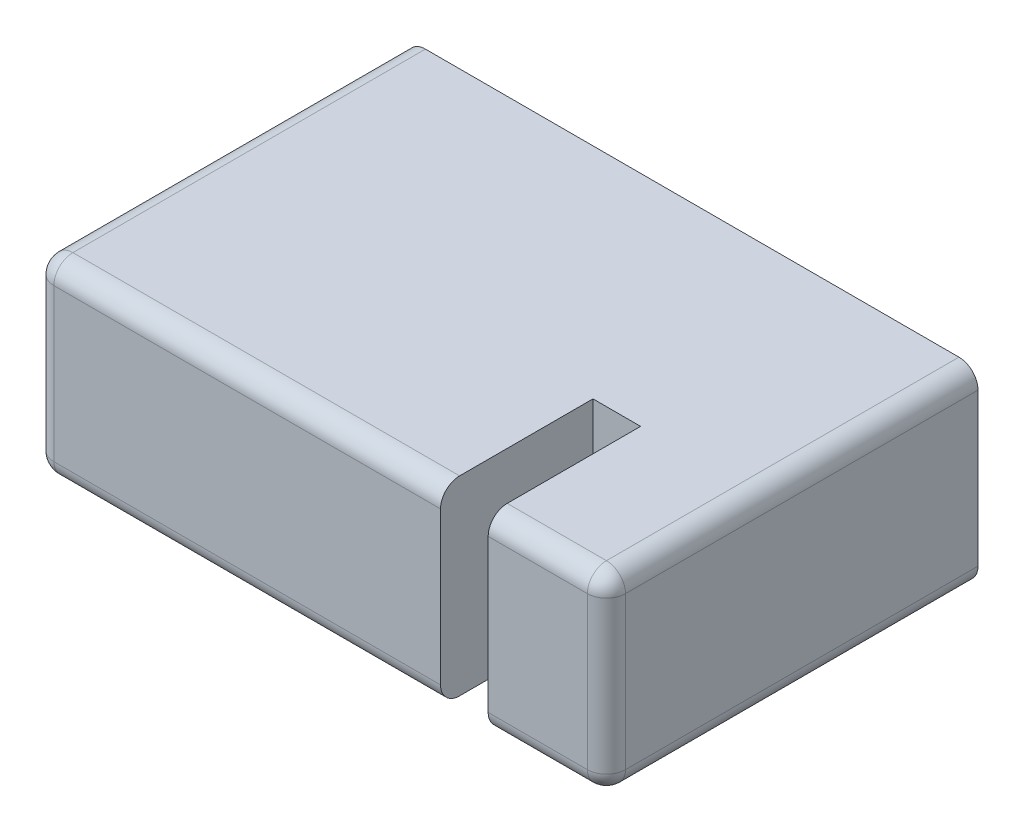
ISO-10303-21;
HEADER;
FILE_DESCRIPTION(('STEP AP214'),'2;1');
FILE_NAME('part.step','',(''),(''),'','','');
FILE_SCHEMA(('AUTOMOTIVE_DESIGN { 1 0 10303 214 1 1 1 1 }'));
ENDSEC;
DATA;
#1=APPLICATION_CONTEXT('core data for automotive mechanical design processes');
#2=APPLICATION_PROTOCOL_DEFINITION('international standard','automotive_design',2000,#1);
#3=PRODUCT_CONTEXT('',#1,'mechanical');
#4=PRODUCT('Part','Part','',(#3));
#5=PRODUCT_RELATED_PRODUCT_CATEGORY('part','',(#4));
#6=PRODUCT_DEFINITION_FORMATION('','',#4);
#7=PRODUCT_DEFINITION_CONTEXT('part definition',#1,'design');
#8=PRODUCT_DEFINITION('design','',#6,#7);
#9=PRODUCT_DEFINITION_SHAPE('','',#8);
#10=(LENGTH_UNIT() NAMED_UNIT(*) SI_UNIT(.MILLI.,.METRE.));
#11=(NAMED_UNIT(*) PLANE_ANGLE_UNIT() SI_UNIT($,.RADIAN.));
#12=(NAMED_UNIT(*) SI_UNIT($,.STERADIAN.) SOLID_ANGLE_UNIT());
#13=UNCERTAINTY_MEASURE_WITH_UNIT(LENGTH_MEASURE(1.E-05),#10,'distance_accuracy_value','');
#14=(GEOMETRIC_REPRESENTATION_CONTEXT(3) GLOBAL_UNCERTAINTY_ASSIGNED_CONTEXT((#13)) GLOBAL_UNIT_ASSIGNED_CONTEXT((#10,
#11,#12)) REPRESENTATION_CONTEXT('',''));
#15=CARTESIAN_POINT('',(0.,0.,0.));
#16=DIRECTION('',(0.,0.,1.));
#17=DIRECTION('',(1.,0.,0.));
#18=AXIS2_PLACEMENT_3D('',#15,#16,#17);
#19=CARTESIAN_POINT('',(0.,25.4,49.53));
#20=DIRECTION('',(0.,0.,-1.));
#21=DIRECTION('',(-1.,0.,0.));
#22=AXIS2_PLACEMENT_3D('',#19,#20,#21);
#23=PLANE('',#22);
#24=DIRECTION('',(0.,-1.,0.));
#25=VECTOR('',#24,1.);
#26=CARTESIAN_POINT('',(54.0858713282636,25.4,49.53));
#27=LINE('',#26,#25);
#28=CARTESIAN_POINT('',(54.0858713282636,22.86,49.53));
#29=VERTEX_POINT('',#28);
#30=CARTESIAN_POINT('',(54.0858713282636,2.54,49.53));
#31=VERTEX_POINT('',#30);
#32=EDGE_CURVE('E195',#29,#31,#27,.T.);
#33=ORIENTED_EDGE('',*,*,#32,.F.);
#34=DIRECTION('',(-1.,0.,0.));
#35=VECTOR('',#34,1.);
#36=CARTESIAN_POINT('',(0.,22.86,49.53));
#37=LINE('',#36,#35);
#38=CARTESIAN_POINT('',(2.54,22.86,49.53));
#39=VERTEX_POINT('',#38);
#40=EDGE_CURVE('E243',#29,#39,#37,.T.);
#41=ORIENTED_EDGE('',*,*,#40,.T.);
#42=DIRECTION('',(0.,-1.,0.));
#43=VECTOR('',#42,1.);
#44=CARTESIAN_POINT('',(2.54,25.4,49.53));
#45=LINE('',#44,#43);
#46=CARTESIAN_POINT('',(2.54,2.54,49.53));
#47=VERTEX_POINT('',#46);
#48=EDGE_CURVE('E241',#39,#47,#45,.T.);
#49=ORIENTED_EDGE('',*,*,#48,.T.);
#50=DIRECTION('',(1.,0.,0.));
#51=VECTOR('',#50,1.);
#52=CARTESIAN_POINT('',(0.,2.54,49.53));
#53=LINE('',#52,#51);
#54=EDGE_CURVE('E239',#47,#31,#53,.T.);
#55=ORIENTED_EDGE('',*,*,#54,.T.);
#56=EDGE_LOOP('',(#33,#41,#49,#55));
#57=FACE_BOUND('',#56,.T.);
#58=ADVANCED_FACE('F38',(#57),#23,.F.);
#59=CARTESIAN_POINT('',(0.,0.,49.53));
#60=DIRECTION('',(1.,0.,0.));
#61=DIRECTION('',(0.,0.,-1.));
#62=AXIS2_PLACEMENT_3D('',#59,#60,#61);
#63=PLANE('',#62);
#64=DIRECTION('',(0.,-1.,0.));
#65=VECTOR('',#64,1.);
#66=CARTESIAN_POINT('',(0.,0.,46.99));
#67=LINE('',#66,#65);
#68=CARTESIAN_POINT('',(0.,2.54,46.99));
#69=VERTEX_POINT('',#68);
#70=CARTESIAN_POINT('',(0.,22.86,46.99));
#71=VERTEX_POINT('',#70);
#72=EDGE_CURVE('E218',#69,#71,#67,.F.);
#73=ORIENTED_EDGE('',*,*,#72,.T.);
#74=DIRECTION('',(0.,0.,-1.));
#75=VECTOR('',#74,1.);
#76=CARTESIAN_POINT('',(0.,22.86,49.53));
#77=LINE('',#76,#75);
#78=CARTESIAN_POINT('',(0.,22.86,0.));
#79=VERTEX_POINT('',#78);
#80=EDGE_CURVE('E220',#71,#79,#77,.T.);
#81=ORIENTED_EDGE('',*,*,#80,.T.);
#82=DIRECTION('',(0.,-1.,0.));
#83=VECTOR('',#82,1.);
#84=CARTESIAN_POINT('',(0.,0.,0.));
#85=LINE('',#84,#83);
#86=CARTESIAN_POINT('',(0.,2.54,0.));
#87=VERTEX_POINT('',#86);
#88=EDGE_CURVE('E198',#79,#87,#85,.T.);
#89=ORIENTED_EDGE('',*,*,#88,.T.);
#90=DIRECTION('',(0.,0.,-1.));
#91=VECTOR('',#90,1.);
#92=CARTESIAN_POINT('',(0.,2.54,49.53));
#93=LINE('',#92,#91);
#94=EDGE_CURVE('E216',#87,#69,#93,.F.);
#95=ORIENTED_EDGE('',*,*,#94,.T.);
#96=EDGE_LOOP('',(#73,#81,#89,#95));
#97=FACE_BOUND('',#96,.T.);
#98=ADVANCED_FACE('F332',(#97),#63,.F.);
#99=CARTESIAN_POINT('',(0.,0.,49.53));
#100=DIRECTION('',(0.,1.,0.));
#101=DIRECTION('',(0.,0.,1.));
#102=AXIS2_PLACEMENT_3D('',#99,#100,#101);
#103=PLANE('',#102);
#104=DIRECTION('',(1.,0.,0.));
#105=VECTOR('',#104,1.);
#106=CARTESIAN_POINT('',(0.,0.,46.99));
#107=LINE('',#106,#105);
#108=CARTESIAN_POINT('',(54.0858713282636,0.,46.99));
#109=VERTEX_POINT('',#108);
#110=CARTESIAN_POINT('',(2.54,0.,46.99));
#111=VERTEX_POINT('',#110);
#112=EDGE_CURVE('E253',#109,#111,#107,.F.);
#113=ORIENTED_EDGE('',*,*,#112,.T.);
#114=DIRECTION('',(0.,0.,-1.));
#115=VECTOR('',#114,1.);
#116=CARTESIAN_POINT('',(2.54,0.,49.53));
#117=LINE('',#116,#115);
#118=CARTESIAN_POINT('',(2.54,0.,0.));
#119=VERTEX_POINT('',#118);
#120=EDGE_CURVE('E255',#111,#119,#117,.T.);
#121=ORIENTED_EDGE('',*,*,#120,.T.);
#122=DIRECTION('',(1.,0.,0.));
#123=VECTOR('',#122,1.);
#124=CARTESIAN_POINT('',(0.,0.,0.));
#125=LINE('',#124,#123);
#126=CARTESIAN_POINT('',(73.66,0.,0.));
#127=VERTEX_POINT('',#126);
#128=EDGE_CURVE('E207',#119,#127,#125,.T.);
#129=ORIENTED_EDGE('',*,*,#128,.T.);
#130=DIRECTION('',(0.,0.,-1.));
#131=VECTOR('',#130,1.);
#132=CARTESIAN_POINT('',(73.66,0.,49.53));
#133=LINE('',#132,#131);
#134=CARTESIAN_POINT('',(73.66,0.,46.99));
#135=VERTEX_POINT('',#134);
#136=EDGE_CURVE('E251',#127,#135,#133,.F.);
#137=ORIENTED_EDGE('',*,*,#136,.T.);
#138=DIRECTION('',(1.,0.,0.));
#139=VECTOR('',#138,1.);
#140=CARTESIAN_POINT('',(0.,0.,46.99));
#141=LINE('',#140,#139);
#142=CARTESIAN_POINT('',(60.4358713282636,0.,46.99));
#143=VERTEX_POINT('',#142);
#144=EDGE_CURVE('E249',#135,#143,#141,.F.);
#145=ORIENTED_EDGE('',*,*,#144,.T.);
#146=DIRECTION('',(0.,0.,1.));
#147=VECTOR('',#146,1.);
#148=CARTESIAN_POINT('',(60.4358713282636,0.,49.53));
#149=LINE('',#148,#147);
#150=CARTESIAN_POINT('',(60.4358713282636,0.,29.21));
#151=VERTEX_POINT('',#150);
#152=EDGE_CURVE('E180',#151,#143,#149,.T.);
#153=ORIENTED_EDGE('',*,*,#152,.F.);
#154=DIRECTION('',(1.,0.,0.));
#155=VECTOR('',#154,1.);
#156=CARTESIAN_POINT('',(54.0858713282636,0.,29.21));
#157=LINE('',#156,#155);
#158=CARTESIAN_POINT('',(54.0858713282636,0.,29.21));
#159=VERTEX_POINT('',#158);
#160=EDGE_CURVE('E189',#159,#151,#157,.T.);
#161=ORIENTED_EDGE('',*,*,#160,.F.);
#162=DIRECTION('',(0.,0.,-1.));
#163=VECTOR('',#162,1.);
#164=CARTESIAN_POINT('',(54.0858713282636,0.,49.53));
#165=LINE('',#164,#163);
#166=EDGE_CURVE('E187',#109,#159,#165,.T.);
#167=ORIENTED_EDGE('',*,*,#166,.F.);
#168=EDGE_LOOP('',(#113,#121,#129,#137,#145,#153,#161,#167));
#169=FACE_BOUND('',#168,.T.);
#170=ADVANCED_FACE('F377',(#169),#103,.F.);
#171=CARTESIAN_POINT('',(76.2,0.,49.53));
#172=DIRECTION('',(-1.,0.,0.));
#173=DIRECTION('',(0.,0.,1.));
#174=AXIS2_PLACEMENT_3D('',#171,#172,#173);
#175=PLANE('',#174);
#176=DIRECTION('',(0.,1.,0.));
#177=VECTOR('',#176,1.);
#178=CARTESIAN_POINT('',(76.2,0.,46.99));
#179=LINE('',#178,#177);
#180=CARTESIAN_POINT('',(76.2,22.86,46.99));
#181=VERTEX_POINT('',#180);
#182=CARTESIAN_POINT('',(76.2,2.54,46.99));
#183=VERTEX_POINT('',#182);
#184=EDGE_CURVE('E257',#181,#183,#179,.F.);
#185=ORIENTED_EDGE('',*,*,#184,.T.);
#186=DIRECTION('',(0.,0.,-1.));
#187=VECTOR('',#186,1.);
#188=CARTESIAN_POINT('',(76.2,2.54,49.53));
#189=LINE('',#188,#187);
#190=CARTESIAN_POINT('',(76.2,2.54,0.));
#191=VERTEX_POINT('',#190);
#192=EDGE_CURVE('E261',#183,#191,#189,.T.);
#193=ORIENTED_EDGE('',*,*,#192,.T.);
#194=DIRECTION('',(0.,1.,0.));
#195=VECTOR('',#194,1.);
#196=CARTESIAN_POINT('',(76.2,0.,0.));
#197=LINE('',#196,#195);
#198=CARTESIAN_POINT('',(76.2,22.86,0.));
#199=VERTEX_POINT('',#198);
#200=EDGE_CURVE('E210',#191,#199,#197,.T.);
#201=ORIENTED_EDGE('',*,*,#200,.T.);
#202=DIRECTION('',(0.,0.,-1.));
#203=VECTOR('',#202,1.);
#204=CARTESIAN_POINT('',(76.2,22.86,49.53));
#205=LINE('',#204,#203);
#206=EDGE_CURVE('E259',#199,#181,#205,.F.);
#207=ORIENTED_EDGE('',*,*,#206,.T.);
#208=EDGE_LOOP('',(#185,#193,#201,#207));
#209=FACE_BOUND('',#208,.T.);
#210=ADVANCED_FACE('F313',(#209),#175,.F.);
#211=CARTESIAN_POINT('',(0.,25.4,49.53));
#212=DIRECTION('',(0.,-1.,0.));
#213=DIRECTION('',(0.,0.,-1.));
#214=AXIS2_PLACEMENT_3D('',#211,#212,#213);
#215=PLANE('',#214);
#216=DIRECTION('',(-1.,0.,0.));
#217=VECTOR('',#216,1.);
#218=CARTESIAN_POINT('',(0.,25.4,0.));
#219=LINE('',#218,#217);
#220=CARTESIAN_POINT('',(73.66,25.4,0.));
#221=VERTEX_POINT('',#220);
#222=CARTESIAN_POINT('',(2.54,25.4,0.));
#223=VERTEX_POINT('',#222);
#224=EDGE_CURVE('E213',#221,#223,#219,.T.);
#225=ORIENTED_EDGE('',*,*,#224,.T.);
#226=DIRECTION('',(0.,0.,-1.));
#227=VECTOR('',#226,1.);
#228=CARTESIAN_POINT('',(2.54,25.4,49.53));
#229=LINE('',#228,#227);
#230=CARTESIAN_POINT('',(2.54,25.4,46.99));
#231=VERTEX_POINT('',#230);
#232=EDGE_CURVE('E237',#223,#231,#229,.F.);
#233=ORIENTED_EDGE('',*,*,#232,.T.);
#234=DIRECTION('',(-1.,0.,0.));
#235=VECTOR('',#234,1.);
#236=CARTESIAN_POINT('',(0.,25.4,46.99));
#237=LINE('',#236,#235);
#238=CARTESIAN_POINT('',(54.0858713282636,25.4,46.99));
#239=VERTEX_POINT('',#238);
#240=EDGE_CURVE('E235',#231,#239,#237,.F.);
#241=ORIENTED_EDGE('',*,*,#240,.T.);
#242=DIRECTION('',(0.,0.,-1.));
#243=VECTOR('',#242,1.);
#244=CARTESIAN_POINT('',(54.0858713282636,25.4,49.53));
#245=LINE('',#244,#243);
#246=CARTESIAN_POINT('',(54.0858713282636,25.4,29.21));
#247=VERTEX_POINT('',#246);
#248=EDGE_CURVE('E177',#239,#247,#245,.T.);
#249=ORIENTED_EDGE('',*,*,#248,.T.);
#250=DIRECTION('',(1.,0.,0.));
#251=VECTOR('',#250,1.);
#252=CARTESIAN_POINT('',(54.0858713282636,25.4,29.21));
#253=LINE('',#252,#251);
#254=CARTESIAN_POINT('',(60.4358713282636,25.4,29.21));
#255=VERTEX_POINT('',#254);
#256=EDGE_CURVE('E179',#247,#255,#253,.T.);
#257=ORIENTED_EDGE('',*,*,#256,.T.);
#258=DIRECTION('',(0.,0.,1.));
#259=VECTOR('',#258,1.);
#260=CARTESIAN_POINT('',(60.4358713282636,25.4,49.53));
#261=LINE('',#260,#259);
#262=CARTESIAN_POINT('',(60.4358713282636,25.4,46.99));
#263=VERTEX_POINT('',#262);
#264=EDGE_CURVE('E183',#255,#263,#261,.T.);
#265=ORIENTED_EDGE('',*,*,#264,.T.);
#266=DIRECTION('',(-1.,0.,0.));
#267=VECTOR('',#266,1.);
#268=CARTESIAN_POINT('',(0.,25.4,46.99));
#269=LINE('',#268,#267);
#270=CARTESIAN_POINT('',(73.66,25.4,46.99));
#271=VERTEX_POINT('',#270);
#272=EDGE_CURVE('E231',#263,#271,#269,.F.);
#273=ORIENTED_EDGE('',*,*,#272,.T.);
#274=DIRECTION('',(0.,0.,-1.));
#275=VECTOR('',#274,1.);
#276=CARTESIAN_POINT('',(73.66,25.4,49.53));
#277=LINE('',#276,#275);
#278=EDGE_CURVE('E233',#271,#221,#277,.T.);
#279=ORIENTED_EDGE('',*,*,#278,.T.);
#280=EDGE_LOOP('',(#225,#233,#241,#249,#257,#265,#273,#279));
#281=FACE_BOUND('',#280,.T.);
#282=ADVANCED_FACE('F323',(#281),#215,.F.);
#283=DIRECTION('',(0.,1.,0.));
#284=VECTOR('',#283,1.);
#285=CARTESIAN_POINT('',(73.66,25.4,49.53));
#286=LINE('',#285,#284);
#287=CARTESIAN_POINT('',(73.66,2.54,49.53));
#288=VERTEX_POINT('',#287);
#289=CARTESIAN_POINT('',(73.66,22.86,49.53));
#290=VERTEX_POINT('',#289);
#291=EDGE_CURVE('E55',#288,#290,#286,.T.);
#292=ORIENTED_EDGE('',*,*,#291,.T.);
#293=DIRECTION('',(-1.,0.,0.));
#294=VECTOR('',#293,1.);
#295=CARTESIAN_POINT('',(0.,22.86,49.53));
#296=LINE('',#295,#294);
#297=CARTESIAN_POINT('',(60.4358713282636,22.86,49.53));
#298=VERTEX_POINT('',#297);
#299=EDGE_CURVE('E266',#290,#298,#296,.T.);
#300=ORIENTED_EDGE('',*,*,#299,.T.);
#301=DIRECTION('',(0.,-1.,0.));
#302=VECTOR('',#301,1.);
#303=CARTESIAN_POINT('',(60.4358713282636,25.4,49.53));
#304=LINE('',#303,#302);
#305=CARTESIAN_POINT('',(60.4358713282636,2.54,49.53));
#306=VERTEX_POINT('',#305);
#307=EDGE_CURVE('E199',#298,#306,#304,.T.);
#308=ORIENTED_EDGE('',*,*,#307,.T.);
#309=DIRECTION('',(1.,0.,0.));
#310=VECTOR('',#309,1.);
#311=CARTESIAN_POINT('',(0.,2.54,49.53));
#312=LINE('',#311,#310);
#313=EDGE_CURVE('E60',#306,#288,#312,.T.);
#314=ORIENTED_EDGE('',*,*,#313,.T.);
#315=EDGE_LOOP('',(#292,#300,#308,#314));
#316=FACE_BOUND('',#315,.T.);
#317=ADVANCED_FACE('F365',(#316),#23,.F.);
#318=CARTESIAN_POINT('',(0.,25.4,0.));
#319=DIRECTION('',(0.,0.,-1.));
#320=DIRECTION('',(-1.,0.,0.));
#321=AXIS2_PLACEMENT_3D('',#318,#319,#320);
#322=PLANE('',#321);
#323=CARTESIAN_POINT('',(66.04,12.7,0.));
#324=DIRECTION('',(0.,0.,-1.));
#325=DIRECTION('',(-1.,0.,0.));
#326=AXIS2_PLACEMENT_3D('',#323,#324,#325);
#327=CIRCLE('',#326,2.01929999999999);
#328=CARTESIAN_POINT('',(64.0207,12.7,0.));
#329=VERTEX_POINT('',#328);
#330=EDGE_CURVE('E166',#329,#329,#327,.T.);
#331=ORIENTED_EDGE('',*,*,#330,.F.);
#332=EDGE_LOOP('',(#331));
#333=FACE_BOUND('',#332,.T.);
#334=CARTESIAN_POINT('',(19.05,12.7,0.));
#335=DIRECTION('',(0.,0.,-1.));
#336=DIRECTION('',(-1.,0.,0.));
#337=AXIS2_PLACEMENT_3D('',#334,#335,#336);
#338=CIRCLE('',#337,2.01929999999999);
#339=CARTESIAN_POINT('',(17.0307,12.7,0.));
#340=VERTEX_POINT('',#339);
#341=EDGE_CURVE('E165',#340,#340,#338,.T.);
#342=ORIENTED_EDGE('',*,*,#341,.F.);
#343=EDGE_LOOP('',(#342));
#344=FACE_BOUND('',#343,.T.);
#345=ORIENTED_EDGE('',*,*,#88,.F.);
#346=CARTESIAN_POINT('',(2.54,22.86,0.));
#347=DIRECTION('',(0.,0.,-1.));
#348=DIRECTION('',(-1.,0.,0.));
#349=AXIS2_PLACEMENT_3D('',#346,#347,#348);
#350=CIRCLE('',#349,2.54);
#351=EDGE_CURVE('E229',#79,#223,#350,.T.);
#352=ORIENTED_EDGE('',*,*,#351,.T.);
#353=ORIENTED_EDGE('',*,*,#224,.F.);
#354=CARTESIAN_POINT('',(73.66,22.86,0.));
#355=DIRECTION('',(0.,0.,-1.));
#356=DIRECTION('',(-1.,0.,0.));
#357=AXIS2_PLACEMENT_3D('',#354,#355,#356);
#358=CIRCLE('',#357,2.54);
#359=EDGE_CURVE('E223',#221,#199,#358,.T.);
#360=ORIENTED_EDGE('',*,*,#359,.T.);
#361=ORIENTED_EDGE('',*,*,#200,.F.);
#362=CARTESIAN_POINT('',(73.66,2.54,0.));
#363=DIRECTION('',(0.,0.,-1.));
#364=DIRECTION('',(-1.,0.,0.));
#365=AXIS2_PLACEMENT_3D('',#362,#363,#364);
#366=CIRCLE('',#365,2.54);
#367=EDGE_CURVE('E225',#191,#127,#366,.T.);
#368=ORIENTED_EDGE('',*,*,#367,.T.);
#369=ORIENTED_EDGE('',*,*,#128,.F.);
#370=CARTESIAN_POINT('',(2.54,2.54,0.));
#371=DIRECTION('',(0.,0.,-1.));
#372=DIRECTION('',(-1.,0.,0.));
#373=AXIS2_PLACEMENT_3D('',#370,#371,#372);
#374=CIRCLE('',#373,2.54);
#375=EDGE_CURVE('E227',#119,#87,#374,.T.);
#376=ORIENTED_EDGE('',*,*,#375,.T.);
#377=EDGE_LOOP('',(#345,#352,#353,#360,#361,#368,#369,#376));
#378=FACE_BOUND('',#377,.T.);
#379=ADVANCED_FACE('F327',(#333,#344,#378),#322,.T.);
#380=CARTESIAN_POINT('',(54.0858713282636,25.4,49.53));
#381=DIRECTION('',(-1.,0.,0.));
#382=DIRECTION('',(0.,0.,1.));
#383=AXIS2_PLACEMENT_3D('',#380,#381,#382);
#384=PLANE('',#383);
#385=ORIENTED_EDGE('',*,*,#248,.F.);
#386=CARTESIAN_POINT('',(54.0858713282636,22.86,46.99));
#387=DIRECTION('',(-1.,0.,0.));
#388=DIRECTION('',(0.,0.,1.));
#389=AXIS2_PLACEMENT_3D('',#386,#387,#388);
#390=CIRCLE('',#389,2.54);
#391=EDGE_CURVE('E247',#239,#29,#390,.F.);
#392=ORIENTED_EDGE('',*,*,#391,.T.);
#393=ORIENTED_EDGE('',*,*,#32,.T.);
#394=CARTESIAN_POINT('',(54.0858713282636,2.54,46.99));
#395=DIRECTION('',(-1.,0.,0.));
#396=DIRECTION('',(0.,0.,1.));
#397=AXIS2_PLACEMENT_3D('',#394,#395,#396);
#398=CIRCLE('',#397,2.54);
#399=EDGE_CURVE('E245',#31,#109,#398,.F.);
#400=ORIENTED_EDGE('',*,*,#399,.T.);
#401=ORIENTED_EDGE('',*,*,#166,.T.);
#402=DIRECTION('',(0.,-1.,0.));
#403=VECTOR('',#402,1.);
#404=CARTESIAN_POINT('',(54.0858713282636,25.4,29.21));
#405=LINE('',#404,#403);
#406=EDGE_CURVE('E186',#247,#159,#405,.T.);
#407=ORIENTED_EDGE('',*,*,#406,.F.);
#408=EDGE_LOOP('',(#385,#392,#393,#400,#401,#407));
#409=FACE_BOUND('',#408,.T.);
#410=ADVANCED_FACE('F352',(#409),#384,.F.);
#411=CARTESIAN_POINT('',(60.4358713282636,25.4,49.53));
#412=DIRECTION('',(1.,0.,0.));
#413=DIRECTION('',(0.,0.,-1.));
#414=AXIS2_PLACEMENT_3D('',#411,#412,#413);
#415=PLANE('',#414);
#416=ORIENTED_EDGE('',*,*,#307,.F.);
#417=CARTESIAN_POINT('',(60.4358713282636,22.86,46.99));
#418=DIRECTION('',(1.,0.,0.));
#419=DIRECTION('',(0.,0.,-1.));
#420=AXIS2_PLACEMENT_3D('',#417,#418,#419);
#421=CIRCLE('',#420,2.54);
#422=EDGE_CURVE('E11',#298,#263,#421,.F.);
#423=ORIENTED_EDGE('',*,*,#422,.T.);
#424=ORIENTED_EDGE('',*,*,#264,.F.);
#425=DIRECTION('',(0.,-1.,0.));
#426=VECTOR('',#425,1.);
#427=CARTESIAN_POINT('',(60.4358713282636,25.4,29.21));
#428=LINE('',#427,#426);
#429=EDGE_CURVE('E201',#255,#151,#428,.T.);
#430=ORIENTED_EDGE('',*,*,#429,.T.);
#431=ORIENTED_EDGE('',*,*,#152,.T.);
#432=CARTESIAN_POINT('',(60.4358713282636,2.54,46.99));
#433=DIRECTION('',(1.,0.,0.));
#434=DIRECTION('',(0.,0.,-1.));
#435=AXIS2_PLACEMENT_3D('',#432,#433,#434);
#436=CIRCLE('',#435,2.54);
#437=EDGE_CURVE('E47',#143,#306,#436,.F.);
#438=ORIENTED_EDGE('',*,*,#437,.T.);
#439=EDGE_LOOP('',(#416,#423,#424,#430,#431,#438));
#440=FACE_BOUND('',#439,.T.);
#441=ADVANCED_FACE('F363',(#440),#415,.F.);
#442=CARTESIAN_POINT('',(54.0858713282636,25.4,29.21));
#443=DIRECTION('',(0.,0.,-1.));
#444=DIRECTION('',(-1.,0.,0.));
#445=AXIS2_PLACEMENT_3D('',#442,#443,#444);
#446=PLANE('',#445);
#447=ORIENTED_EDGE('',*,*,#160,.T.);
#448=ORIENTED_EDGE('',*,*,#429,.F.);
#449=ORIENTED_EDGE('',*,*,#256,.F.);
#450=ORIENTED_EDGE('',*,*,#406,.T.);
#451=EDGE_LOOP('',(#447,#448,#449,#450));
#452=FACE_BOUND('',#451,.T.);
#453=ADVANCED_FACE('F358',(#452),#446,.F.);
#454=CARTESIAN_POINT('',(0.,2.54,46.99));
#455=DIRECTION('',(1.,0.,0.));
#456=DIRECTION('',(0.,0.,-1.));
#457=AXIS2_PLACEMENT_3D('',#454,#455,#456);
#458=CYLINDRICAL_SURFACE('',#457,2.54);
#459=ORIENTED_EDGE('',*,*,#399,.F.);
#460=ORIENTED_EDGE('',*,*,#54,.F.);
#461=CARTESIAN_POINT('',(2.54,2.54,46.99));
#462=DIRECTION('',(-1.,0.,0.));
#463=DIRECTION('',(0.,0.,1.));
#464=AXIS2_PLACEMENT_3D('',#461,#462,#463);
#465=CIRCLE('',#464,2.54);
#466=EDGE_CURVE('E190',#111,#47,#465,.T.);
#467=ORIENTED_EDGE('',*,*,#466,.F.);
#468=ORIENTED_EDGE('',*,*,#112,.F.);
#469=EDGE_LOOP('',(#459,#460,#467,#468));
#470=FACE_BOUND('',#469,.T.);
#471=ADVANCED_FACE('F387',(#470),#458,.T.);
#472=CARTESIAN_POINT('',(2.54,2.54,49.53));
#473=DIRECTION('',(0.,0.,-1.));
#474=DIRECTION('',(-1.,0.,0.));
#475=AXIS2_PLACEMENT_3D('',#472,#473,#474);
#476=CYLINDRICAL_SURFACE('',#475,2.54);
#477=ORIENTED_EDGE('',*,*,#375,.F.);
#478=ORIENTED_EDGE('',*,*,#120,.F.);
#479=CARTESIAN_POINT('',(2.54,2.54,46.99));
#480=DIRECTION('',(0.,0.,1.));
#481=DIRECTION('',(1.,0.,0.));
#482=AXIS2_PLACEMENT_3D('',#479,#480,#481);
#483=CIRCLE('',#482,2.54);
#484=EDGE_CURVE('E281',#69,#111,#483,.T.);
#485=ORIENTED_EDGE('',*,*,#484,.F.);
#486=ORIENTED_EDGE('',*,*,#94,.F.);
#487=EDGE_LOOP('',(#477,#478,#485,#486));
#488=FACE_BOUND('',#487,.T.);
#489=ADVANCED_FACE('F382',(#488),#476,.T.);
#490=CARTESIAN_POINT('',(2.54,2.54,46.99));
#491=DIRECTION('',(0.,0.,1.));
#492=DIRECTION('',(1.,0.,0.));
#493=AXIS2_PLACEMENT_3D('',#490,#491,#492);
#494=SPHERICAL_SURFACE('',#493,2.54);
#495=ORIENTED_EDGE('',*,*,#484,.T.);
#496=ORIENTED_EDGE('',*,*,#466,.T.);
#497=CARTESIAN_POINT('',(2.54,2.54,46.99));
#498=DIRECTION('',(0.,-1.,0.));
#499=DIRECTION('',(1.,0.,0.));
#500=AXIS2_PLACEMENT_3D('',#497,#498,#499);
#501=CIRCLE('',#500,2.54);
#502=EDGE_CURVE('E278',#69,#47,#501,.F.);
#503=ORIENTED_EDGE('',*,*,#502,.F.);
#504=EDGE_LOOP('',(#495,#496,#503));
#505=FACE_BOUND('',#504,.T.);
#506=ADVANCED_FACE('F389',(#505),#494,.T.);
#507=CARTESIAN_POINT('',(0.,22.86,46.99));
#508=DIRECTION('',(-1.,0.,0.));
#509=DIRECTION('',(0.,0.,1.));
#510=AXIS2_PLACEMENT_3D('',#507,#508,#509);
#511=CYLINDRICAL_SURFACE('',#510,2.54);
#512=ORIENTED_EDGE('',*,*,#391,.F.);
#513=ORIENTED_EDGE('',*,*,#240,.F.);
#514=CARTESIAN_POINT('',(2.54,22.86,46.99));
#515=DIRECTION('',(-1.,0.,0.));
#516=DIRECTION('',(0.,0.,1.));
#517=AXIS2_PLACEMENT_3D('',#514,#515,#516);
#518=CIRCLE('',#517,2.54);
#519=EDGE_CURVE('E275',#39,#231,#518,.T.);
#520=ORIENTED_EDGE('',*,*,#519,.F.);
#521=ORIENTED_EDGE('',*,*,#40,.F.);
#522=EDGE_LOOP('',(#512,#513,#520,#521));
#523=FACE_BOUND('',#522,.T.);
#524=ADVANCED_FACE('F348',(#523),#511,.T.);
#525=CARTESIAN_POINT('',(2.54,25.4,46.99));
#526=DIRECTION('',(0.,-1.,0.));
#527=DIRECTION('',(0.,0.,-1.));
#528=AXIS2_PLACEMENT_3D('',#525,#526,#527);
#529=CYLINDRICAL_SURFACE('',#528,2.54);
#530=ORIENTED_EDGE('',*,*,#502,.T.);
#531=ORIENTED_EDGE('',*,*,#48,.F.);
#532=CARTESIAN_POINT('',(2.54,22.86,46.99));
#533=DIRECTION('',(0.,1.,0.));
#534=DIRECTION('',(0.,0.,1.));
#535=AXIS2_PLACEMENT_3D('',#532,#533,#534);
#536=CIRCLE('',#535,2.54);
#537=EDGE_CURVE('E272',#71,#39,#536,.T.);
#538=ORIENTED_EDGE('',*,*,#537,.F.);
#539=ORIENTED_EDGE('',*,*,#72,.F.);
#540=EDGE_LOOP('',(#530,#531,#538,#539));
#541=FACE_BOUND('',#540,.T.);
#542=ADVANCED_FACE('F340',(#541),#529,.T.);
#543=CARTESIAN_POINT('',(2.54,22.86,46.99));
#544=DIRECTION('',(0.,0.,1.));
#545=DIRECTION('',(1.,0.,0.));
#546=AXIS2_PLACEMENT_3D('',#543,#544,#545);
#547=SPHERICAL_SURFACE('',#546,2.54);
#548=ORIENTED_EDGE('',*,*,#537,.T.);
#549=ORIENTED_EDGE('',*,*,#519,.T.);
#550=CARTESIAN_POINT('',(2.54,22.86,46.99));
#551=DIRECTION('',(0.,0.,1.));
#552=DIRECTION('',(1.,0.,0.));
#553=AXIS2_PLACEMENT_3D('',#550,#551,#552);
#554=CIRCLE('',#553,2.54);
#555=EDGE_CURVE('E269',#71,#231,#554,.F.);
#556=ORIENTED_EDGE('',*,*,#555,.F.);
#557=EDGE_LOOP('',(#548,#549,#556));
#558=FACE_BOUND('',#557,.T.);
#559=ADVANCED_FACE('F343',(#558),#547,.T.);
#560=CARTESIAN_POINT('',(2.54,22.86,49.53));
#561=DIRECTION('',(0.,0.,-1.));
#562=DIRECTION('',(-1.,0.,0.));
#563=AXIS2_PLACEMENT_3D('',#560,#561,#562);
#564=CYLINDRICAL_SURFACE('',#563,2.54);
#565=ORIENTED_EDGE('',*,*,#555,.T.);
#566=ORIENTED_EDGE('',*,*,#232,.F.);
#567=ORIENTED_EDGE('',*,*,#351,.F.);
#568=ORIENTED_EDGE('',*,*,#80,.F.);
#569=EDGE_LOOP('',(#565,#566,#567,#568));
#570=FACE_BOUND('',#569,.T.);
#571=ADVANCED_FACE('F330',(#570),#564,.T.);
#572=CARTESIAN_POINT('',(0.,22.86,46.99));
#573=DIRECTION('',(-1.,0.,0.));
#574=DIRECTION('',(0.,0.,1.));
#575=AXIS2_PLACEMENT_3D('',#572,#573,#574);
#576=CYLINDRICAL_SURFACE('',#575,2.54);
#577=ORIENTED_EDGE('',*,*,#422,.F.);
#578=ORIENTED_EDGE('',*,*,#299,.F.);
#579=CARTESIAN_POINT('',(73.66,22.86,46.99));
#580=DIRECTION('',(1.,0.,0.));
#581=DIRECTION('',(0.,0.,-1.));
#582=AXIS2_PLACEMENT_3D('',#579,#580,#581);
#583=CIRCLE('',#582,2.54);
#584=EDGE_CURVE('E42',#271,#290,#583,.T.);
#585=ORIENTED_EDGE('',*,*,#584,.F.);
#586=ORIENTED_EDGE('',*,*,#272,.F.);
#587=EDGE_LOOP('',(#577,#578,#585,#586));
#588=FACE_BOUND('',#587,.T.);
#589=ADVANCED_FACE('F40',(#588),#576,.T.);
#590=CARTESIAN_POINT('',(73.66,22.86,49.53));
#591=DIRECTION('',(0.,0.,-1.));
#592=DIRECTION('',(-1.,0.,0.));
#593=AXIS2_PLACEMENT_3D('',#590,#591,#592);
#594=CYLINDRICAL_SURFACE('',#593,2.54);
#595=ORIENTED_EDGE('',*,*,#359,.F.);
#596=ORIENTED_EDGE('',*,*,#278,.F.);
#597=CARTESIAN_POINT('',(73.66,22.86,46.99));
#598=DIRECTION('',(0.,0.,1.));
#599=DIRECTION('',(1.,0.,0.));
#600=AXIS2_PLACEMENT_3D('',#597,#598,#599);
#601=CIRCLE('',#600,2.54);
#602=EDGE_CURVE('E296',#181,#271,#601,.T.);
#603=ORIENTED_EDGE('',*,*,#602,.F.);
#604=ORIENTED_EDGE('',*,*,#206,.F.);
#605=EDGE_LOOP('',(#595,#596,#603,#604));
#606=FACE_BOUND('',#605,.T.);
#607=ADVANCED_FACE('F320',(#606),#594,.T.);
#608=CARTESIAN_POINT('',(73.66,22.86,46.99));
#609=DIRECTION('',(0.,0.,1.));
#610=DIRECTION('',(1.,0.,0.));
#611=AXIS2_PLACEMENT_3D('',#608,#609,#610);
#612=SPHERICAL_SURFACE('',#611,2.54);
#613=ORIENTED_EDGE('',*,*,#602,.T.);
#614=ORIENTED_EDGE('',*,*,#584,.T.);
#615=CARTESIAN_POINT('',(73.66,22.86,46.99));
#616=DIRECTION('',(0.,1.,0.));
#617=DIRECTION('',(0.,0.,1.));
#618=AXIS2_PLACEMENT_3D('',#615,#616,#617);
#619=CIRCLE('',#618,2.54);
#620=EDGE_CURVE('E294',#181,#290,#619,.F.);
#621=ORIENTED_EDGE('',*,*,#620,.F.);
#622=EDGE_LOOP('',(#613,#614,#621));
#623=FACE_BOUND('',#622,.T.);
#624=ADVANCED_FACE('F303',(#623),#612,.T.);
#625=CARTESIAN_POINT('',(0.,2.54,46.99));
#626=DIRECTION('',(1.,0.,0.));
#627=DIRECTION('',(0.,0.,-1.));
#628=AXIS2_PLACEMENT_3D('',#625,#626,#627);
#629=CYLINDRICAL_SURFACE('',#628,2.54);
#630=ORIENTED_EDGE('',*,*,#437,.F.);
#631=ORIENTED_EDGE('',*,*,#144,.F.);
#632=CARTESIAN_POINT('',(73.66,2.54,46.99));
#633=DIRECTION('',(1.,0.,0.));
#634=DIRECTION('',(0.,0.,-1.));
#635=AXIS2_PLACEMENT_3D('',#632,#633,#634);
#636=CIRCLE('',#635,2.54);
#637=EDGE_CURVE('E291',#288,#135,#636,.T.);
#638=ORIENTED_EDGE('',*,*,#637,.F.);
#639=ORIENTED_EDGE('',*,*,#313,.F.);
#640=EDGE_LOOP('',(#630,#631,#638,#639));
#641=FACE_BOUND('',#640,.T.);
#642=ADVANCED_FACE('F367',(#641),#629,.T.);
#643=CARTESIAN_POINT('',(73.66,25.4,46.99));
#644=DIRECTION('',(0.,1.,0.));
#645=DIRECTION('',(0.,0.,1.));
#646=AXIS2_PLACEMENT_3D('',#643,#644,#645);
#647=CYLINDRICAL_SURFACE('',#646,2.54);
#648=ORIENTED_EDGE('',*,*,#620,.T.);
#649=ORIENTED_EDGE('',*,*,#291,.F.);
#650=CARTESIAN_POINT('',(73.66,2.54,46.99));
#651=DIRECTION('',(0.,-1.,0.));
#652=DIRECTION('',(0.,0.,-1.));
#653=AXIS2_PLACEMENT_3D('',#650,#651,#652);
#654=CIRCLE('',#653,2.54);
#655=EDGE_CURVE('E288',#183,#288,#654,.T.);
#656=ORIENTED_EDGE('',*,*,#655,.F.);
#657=ORIENTED_EDGE('',*,*,#184,.F.);
#658=EDGE_LOOP('',(#648,#649,#656,#657));
#659=FACE_BOUND('',#658,.T.);
#660=ADVANCED_FACE('F308',(#659),#647,.T.);
#661=CARTESIAN_POINT('',(73.66,2.54,46.99));
#662=DIRECTION('',(0.,0.,1.));
#663=DIRECTION('',(1.,0.,0.));
#664=AXIS2_PLACEMENT_3D('',#661,#662,#663);
#665=SPHERICAL_SURFACE('',#664,2.54);
#666=ORIENTED_EDGE('',*,*,#655,.T.);
#667=ORIENTED_EDGE('',*,*,#637,.T.);
#668=CARTESIAN_POINT('',(73.66,2.54,46.99));
#669=DIRECTION('',(0.,0.,1.));
#670=DIRECTION('',(1.,0.,0.));
#671=AXIS2_PLACEMENT_3D('',#668,#669,#670);
#672=CIRCLE('',#671,2.54);
#673=EDGE_CURVE('E176',#183,#135,#672,.F.);
#674=ORIENTED_EDGE('',*,*,#673,.F.);
#675=EDGE_LOOP('',(#666,#667,#674));
#676=FACE_BOUND('',#675,.T.);
#677=ADVANCED_FACE('F370',(#676),#665,.T.);
#678=CARTESIAN_POINT('',(73.66,2.54,49.53));
#679=DIRECTION('',(0.,0.,-1.));
#680=DIRECTION('',(-1.,0.,0.));
#681=AXIS2_PLACEMENT_3D('',#678,#679,#680);
#682=CYLINDRICAL_SURFACE('',#681,2.54);
#683=ORIENTED_EDGE('',*,*,#673,.T.);
#684=ORIENTED_EDGE('',*,*,#136,.F.);
#685=ORIENTED_EDGE('',*,*,#367,.F.);
#686=ORIENTED_EDGE('',*,*,#192,.F.);
#687=EDGE_LOOP('',(#683,#684,#685,#686));
#688=FACE_BOUND('',#687,.T.);
#689=ADVANCED_FACE('F373',(#688),#682,.T.);
#690=CARTESIAN_POINT('',(19.05,12.7,13.6144));
#691=DIRECTION('',(0.,0.,-1.));
#692=DIRECTION('',(-1.,0.,0.));
#693=AXIS2_PLACEMENT_3D('',#690,#691,#692);
#694=CONICAL_SURFACE('',#693,2.01929999999999,1.02974425867665);
#695=CARTESIAN_POINT('',(19.05,12.7,14.8277178480024));
#696=VERTEX_POINT('',#695);
#697=VERTEX_LOOP('',#696);
#698=FACE_BOUND('',#697,.T.);
#699=CARTESIAN_POINT('',(19.05,12.7,13.6144));
#700=DIRECTION('',(0.,0.,-1.));
#701=DIRECTION('',(-1.,0.,0.));
#702=AXIS2_PLACEMENT_3D('',#699,#700,#701);
#703=CIRCLE('',#702,2.01929999999999);
#704=CARTESIAN_POINT('',(17.0307,12.7,13.6144));
#705=VERTEX_POINT('',#704);
#706=EDGE_CURVE('E169',#705,#705,#703,.T.);
#707=ORIENTED_EDGE('',*,*,#706,.T.);
#708=EDGE_LOOP('',(#707));
#709=FACE_BOUND('',#708,.T.);
#710=ADVANCED_FACE('F478',(#698,#709),#694,.F.);
#711=CARTESIAN_POINT('',(19.05,12.7,0.));
#712=DIRECTION('',(0.,0.,-1.));
#713=DIRECTION('',(-1.,0.,0.));
#714=AXIS2_PLACEMENT_3D('',#711,#712,#713);
#715=CYLINDRICAL_SURFACE('',#714,2.01929999999999);
#716=ORIENTED_EDGE('',*,*,#706,.F.);
#717=EDGE_LOOP('',(#716));
#718=FACE_BOUND('',#717,.T.);
#719=ORIENTED_EDGE('',*,*,#341,.T.);
#720=EDGE_LOOP('',(#719));
#721=FACE_BOUND('',#720,.T.);
#722=ADVANCED_FACE('F159',(#718,#721),#715,.F.);
#723=CARTESIAN_POINT('',(66.04,12.7,13.6144));
#724=DIRECTION('',(0.,0.,-1.));
#725=DIRECTION('',(-1.,0.,0.));
#726=AXIS2_PLACEMENT_3D('',#723,#724,#725);
#727=CONICAL_SURFACE('',#726,2.01929999999999,1.02974425867665);
#728=CARTESIAN_POINT('',(66.04,12.7,14.8277178480024));
#729=VERTEX_POINT('',#728);
#730=VERTEX_LOOP('',#729);
#731=FACE_BOUND('',#730,.T.);
#732=CARTESIAN_POINT('',(66.04,12.7,13.6144));
#733=DIRECTION('',(0.,0.,-1.));
#734=DIRECTION('',(-1.,0.,0.));
#735=AXIS2_PLACEMENT_3D('',#732,#733,#734);
#736=CIRCLE('',#735,2.01929999999999);
#737=CARTESIAN_POINT('',(64.0207,12.7,13.6144));
#738=VERTEX_POINT('',#737);
#739=EDGE_CURVE('E163',#738,#738,#736,.T.);
#740=ORIENTED_EDGE('',*,*,#739,.T.);
#741=EDGE_LOOP('',(#740));
#742=FACE_BOUND('',#741,.T.);
#743=ADVANCED_FACE('F155',(#731,#742),#727,.F.);
#744=CARTESIAN_POINT('',(66.04,12.7,0.));
#745=DIRECTION('',(0.,0.,-1.));
#746=DIRECTION('',(-1.,0.,0.));
#747=AXIS2_PLACEMENT_3D('',#744,#745,#746);
#748=CYLINDRICAL_SURFACE('',#747,2.01929999999999);
#749=ORIENTED_EDGE('',*,*,#739,.F.);
#750=EDGE_LOOP('',(#749));
#751=FACE_BOUND('',#750,.T.);
#752=ORIENTED_EDGE('',*,*,#330,.T.);
#753=EDGE_LOOP('',(#752));
#754=FACE_BOUND('',#753,.T.);
#755=ADVANCED_FACE('F158',(#751,#754),#748,.F.);
#756=CLOSED_SHELL('',(#58,#98,#170,#210,#282,#317,#379,#410,#441,#453,#471,#489,#506,#524,#542,
#559,#571,#589,#607,#624,#642,#660,#677,#689,#710,#722,#743,#755));
#757=MANIFOLD_SOLID_BREP('B2',#756);
#758=ADVANCED_BREP_SHAPE_REPRESENTATION('',(#18,#757),#14);
#759=SHAPE_DEFINITION_REPRESENTATION(#9,#758);
ENDSEC;
END-ISO-10303-21;
